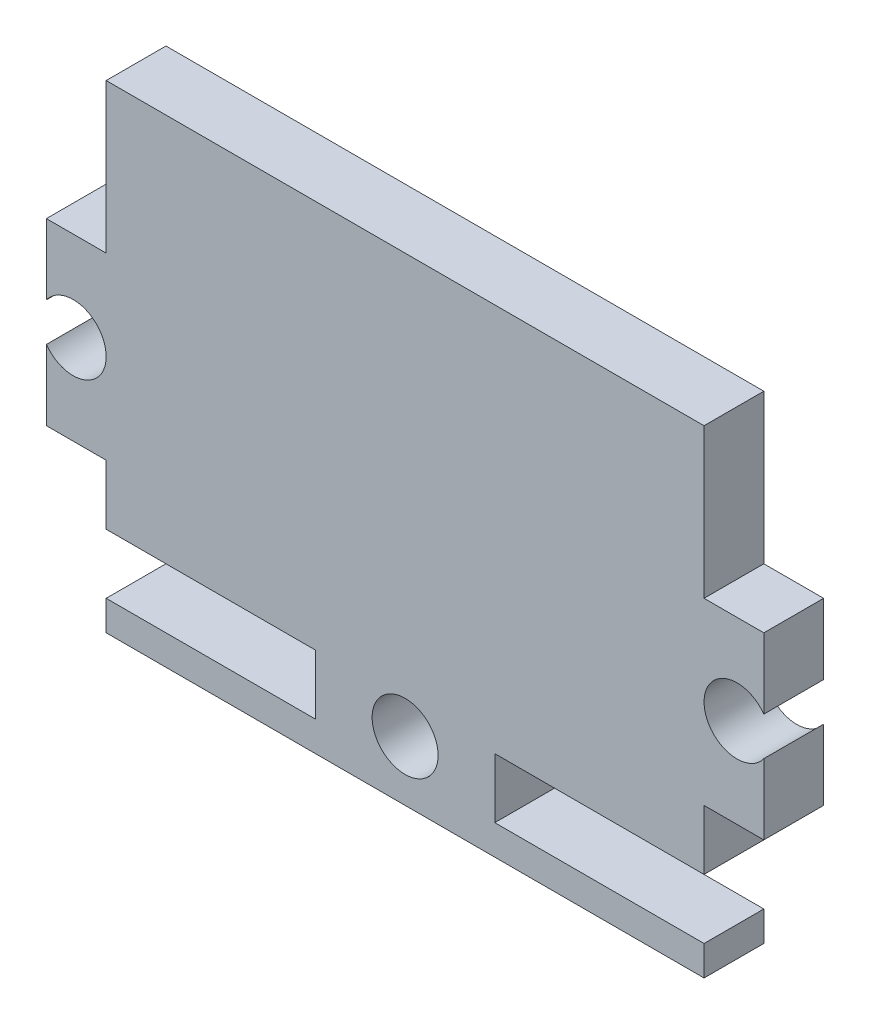
ISO-10303-21;
HEADER;
FILE_DESCRIPTION(('STEP AP214'),'2;1');
FILE_NAME('part.step','',(''),(''),'','','');
FILE_SCHEMA(('AUTOMOTIVE_DESIGN { 1 0 10303 214 1 1 1 1 }'));
ENDSEC;
DATA;
#1=APPLICATION_CONTEXT('core data for automotive mechanical design processes');
#2=APPLICATION_PROTOCOL_DEFINITION('international standard','automotive_design',2000,#1);
#3=PRODUCT_CONTEXT('',#1,'mechanical');
#4=PRODUCT('Part','Part','',(#3));
#5=PRODUCT_RELATED_PRODUCT_CATEGORY('part','',(#4));
#6=PRODUCT_DEFINITION_FORMATION('','',#4);
#7=PRODUCT_DEFINITION_CONTEXT('part definition',#1,'design');
#8=PRODUCT_DEFINITION('design','',#6,#7);
#9=PRODUCT_DEFINITION_SHAPE('','',#8);
#10=(LENGTH_UNIT() NAMED_UNIT(*) SI_UNIT(.MILLI.,.METRE.));
#11=(NAMED_UNIT(*) PLANE_ANGLE_UNIT() SI_UNIT($,.RADIAN.));
#12=(NAMED_UNIT(*) SI_UNIT($,.STERADIAN.) SOLID_ANGLE_UNIT());
#13=UNCERTAINTY_MEASURE_WITH_UNIT(LENGTH_MEASURE(1.E-05),#10,'distance_accuracy_value','');
#14=(GEOMETRIC_REPRESENTATION_CONTEXT(3) GLOBAL_UNCERTAINTY_ASSIGNED_CONTEXT((#13)) GLOBAL_UNIT_ASSIGNED_CONTEXT((#10,
#11,#12)) REPRESENTATION_CONTEXT('',''));
#15=CARTESIAN_POINT('',(0.,0.,0.));
#16=DIRECTION('',(0.,0.,1.));
#17=DIRECTION('',(1.,0.,0.));
#18=AXIS2_PLACEMENT_3D('',#15,#16,#17);
#19=CARTESIAN_POINT('',(38.1,0.,3.175));
#20=DIRECTION('',(-1.,0.,0.));
#21=DIRECTION('',(0.,0.,1.));
#22=AXIS2_PLACEMENT_3D('',#19,#20,#21);
#23=PLANE('',#22);
#24=DIRECTION('',(0.,1.,0.));
#25=VECTOR('',#24,1.);
#26=CARTESIAN_POINT('',(38.1,0.,0.));
#27=LINE('',#26,#25);
#28=CARTESIAN_POINT('',(38.1,7.93749999999999,0.));
#29=VERTEX_POINT('',#28);
#30=CARTESIAN_POINT('',(38.1,11.6760932659661,0.));
#31=VERTEX_POINT('',#30);
#32=EDGE_CURVE('E346',#29,#31,#27,.T.);
#33=ORIENTED_EDGE('',*,*,#32,.T.);
#34=DIRECTION('',(0.,0.,-1.));
#35=VECTOR('',#34,1.);
#36=CARTESIAN_POINT('',(38.1,11.6760932659661,3.175));
#37=LINE('',#36,#35);
#38=CARTESIAN_POINT('',(38.1,11.6760932659661,3.175));
#39=VERTEX_POINT('',#38);
#40=EDGE_CURVE('E11',#39,#31,#37,.T.);
#41=ORIENTED_EDGE('',*,*,#40,.F.);
#42=DIRECTION('',(0.,1.,0.));
#43=VECTOR('',#42,1.);
#44=CARTESIAN_POINT('',(38.1,0.,3.175));
#45=LINE('',#44,#43);
#46=CARTESIAN_POINT('',(38.1,7.93749999999999,3.175));
#47=VERTEX_POINT('',#46);
#48=EDGE_CURVE('E273',#47,#39,#45,.T.);
#49=ORIENTED_EDGE('',*,*,#48,.F.);
#50=DIRECTION('',(0.,0.,-1.));
#51=VECTOR('',#50,1.);
#52=CARTESIAN_POINT('',(38.1,7.93749999999999,3.175));
#53=LINE('',#52,#51);
#54=EDGE_CURVE('E52',#47,#29,#53,.T.);
#55=ORIENTED_EDGE('',*,*,#54,.T.);
#56=EDGE_LOOP('',(#33,#41,#49,#55));
#57=FACE_BOUND('',#56,.T.);
#58=ADVANCED_FACE('F35',(#57),#23,.F.);
#59=CARTESIAN_POINT('',(36.6776,12.7,3.175));
#60=DIRECTION('',(0.,0.,-1.));
#61=DIRECTION('',(-1.,0.,0.));
#62=AXIS2_PLACEMENT_3D('',#59,#60,#61);
#63=CYLINDRICAL_SURFACE('',#62,1.7526);
#64=CARTESIAN_POINT('',(36.6776,12.7,0.));
#65=DIRECTION('',(0.,0.,1.));
#66=DIRECTION('',(1.,0.,0.));
#67=AXIS2_PLACEMENT_3D('',#64,#65,#66);
#68=CIRCLE('',#67,1.7526);
#69=CARTESIAN_POINT('',(38.1,13.7239067340339,0.));
#70=VERTEX_POINT('',#69);
#71=EDGE_CURVE('E341',#31,#70,#68,.F.);
#72=ORIENTED_EDGE('',*,*,#71,.T.);
#73=DIRECTION('',(0.,0.,-1.));
#74=VECTOR('',#73,1.);
#75=CARTESIAN_POINT('',(38.1,13.7239067340339,3.175));
#76=LINE('',#75,#74);
#77=CARTESIAN_POINT('',(38.1,13.7239067340339,3.175));
#78=VERTEX_POINT('',#77);
#79=EDGE_CURVE('E44',#78,#70,#76,.T.);
#80=ORIENTED_EDGE('',*,*,#79,.F.);
#81=CARTESIAN_POINT('',(36.6776,12.7,3.175));
#82=DIRECTION('',(0.,0.,1.));
#83=DIRECTION('',(1.,0.,0.));
#84=AXIS2_PLACEMENT_3D('',#81,#82,#83);
#85=CIRCLE('',#84,1.7526);
#86=EDGE_CURVE('E138',#39,#78,#85,.F.);
#87=ORIENTED_EDGE('',*,*,#86,.F.);
#88=ORIENTED_EDGE('',*,*,#40,.T.);
#89=EDGE_LOOP('',(#72,#80,#87,#88));
#90=FACE_BOUND('',#89,.T.);
#91=ADVANCED_FACE('F411',(#90),#63,.F.);
#92=CARTESIAN_POINT('',(38.1,17.4625,0.));
#93=VERTEX_POINT('',#92);
#94=EDGE_CURVE('E338',#70,#93,#27,.T.);
#95=ORIENTED_EDGE('',*,*,#94,.T.);
#96=DIRECTION('',(0.,0.,-1.));
#97=VECTOR('',#96,1.);
#98=CARTESIAN_POINT('',(38.1,17.4625,3.175));
#99=LINE('',#98,#97);
#100=CARTESIAN_POINT('',(38.1,17.4625,3.175));
#101=VERTEX_POINT('',#100);
#102=EDGE_CURVE('E330',#101,#93,#99,.T.);
#103=ORIENTED_EDGE('',*,*,#102,.F.);
#104=EDGE_CURVE('E271',#78,#101,#45,.T.);
#105=ORIENTED_EDGE('',*,*,#104,.F.);
#106=ORIENTED_EDGE('',*,*,#79,.T.);
#107=EDGE_LOOP('',(#95,#103,#105,#106));
#108=FACE_BOUND('',#107,.T.);
#109=ADVANCED_FACE('F336',(#108),#23,.F.);
#110=CARTESIAN_POINT('',(0.,17.4625,3.175));
#111=DIRECTION('',(0.,-1.,0.));
#112=DIRECTION('',(1.,0.,0.));
#113=AXIS2_PLACEMENT_3D('',#110,#111,#112);
#114=PLANE('',#113);
#115=DIRECTION('',(-1.,0.,0.));
#116=VECTOR('',#115,1.);
#117=CARTESIAN_POINT('',(0.,17.4625,0.));
#118=LINE('',#117,#116);
#119=CARTESIAN_POINT('',(34.925,17.4625,0.));
#120=VERTEX_POINT('',#119);
#121=EDGE_CURVE('E344',#93,#120,#118,.T.);
#122=ORIENTED_EDGE('',*,*,#121,.T.);
#123=DIRECTION('',(0.,0.,-1.));
#124=VECTOR('',#123,1.);
#125=CARTESIAN_POINT('',(34.925,17.4625,3.175));
#126=LINE('',#125,#124);
#127=CARTESIAN_POINT('',(34.925,17.4625,3.175));
#128=VERTEX_POINT('',#127);
#129=EDGE_CURVE('E328',#128,#120,#126,.T.);
#130=ORIENTED_EDGE('',*,*,#129,.F.);
#131=DIRECTION('',(-1.,0.,0.));
#132=VECTOR('',#131,1.);
#133=CARTESIAN_POINT('',(0.,17.4625,3.175));
#134=LINE('',#133,#132);
#135=EDGE_CURVE('E269',#101,#128,#134,.T.);
#136=ORIENTED_EDGE('',*,*,#135,.F.);
#137=ORIENTED_EDGE('',*,*,#102,.T.);
#138=EDGE_LOOP('',(#122,#130,#136,#137));
#139=FACE_BOUND('',#138,.T.);
#140=ADVANCED_FACE('F409',(#139),#114,.F.);
#141=CARTESIAN_POINT('',(34.925,0.,3.175));
#142=DIRECTION('',(1.,0.,0.));
#143=DIRECTION('',(0.,1.,0.));
#144=AXIS2_PLACEMENT_3D('',#141,#142,#143);
#145=PLANE('',#144);
#146=DIRECTION('',(0.,-1.,0.));
#147=VECTOR('',#146,1.);
#148=CARTESIAN_POINT('',(34.925,0.,0.));
#149=LINE('',#148,#147);
#150=CARTESIAN_POINT('',(34.925,25.4,0.));
#151=VERTEX_POINT('',#150);
#152=EDGE_CURVE('E347',#151,#120,#149,.T.);
#153=ORIENTED_EDGE('',*,*,#152,.F.);
#154=DIRECTION('',(0.,0.,-1.));
#155=VECTOR('',#154,1.);
#156=CARTESIAN_POINT('',(34.925,25.4,3.175));
#157=LINE('',#156,#155);
#158=CARTESIAN_POINT('',(34.925,25.4,3.175));
#159=VERTEX_POINT('',#158);
#160=EDGE_CURVE('E326',#159,#151,#157,.T.);
#161=ORIENTED_EDGE('',*,*,#160,.F.);
#162=DIRECTION('',(0.,-1.,0.));
#163=VECTOR('',#162,1.);
#164=CARTESIAN_POINT('',(34.925,0.,3.175));
#165=LINE('',#164,#163);
#166=EDGE_CURVE('E266',#159,#128,#165,.T.);
#167=ORIENTED_EDGE('',*,*,#166,.T.);
#168=ORIENTED_EDGE('',*,*,#129,.T.);
#169=EDGE_LOOP('',(#153,#161,#167,#168));
#170=FACE_BOUND('',#169,.T.);
#171=ADVANCED_FACE('F404',(#170),#145,.T.);
#172=CARTESIAN_POINT('',(0.,25.4,3.175));
#173=DIRECTION('',(0.,1.,0.));
#174=DIRECTION('',(-1.,0.,0.));
#175=AXIS2_PLACEMENT_3D('',#172,#173,#174);
#176=PLANE('',#175);
#177=DIRECTION('',(1.,0.,0.));
#178=VECTOR('',#177,1.);
#179=CARTESIAN_POINT('',(0.,25.4,0.));
#180=LINE('',#179,#178);
#181=CARTESIAN_POINT('',(3.175,25.4,0.));
#182=VERTEX_POINT('',#181);
#183=EDGE_CURVE('E397',#182,#151,#180,.T.);
#184=ORIENTED_EDGE('',*,*,#183,.F.);
#185=DIRECTION('',(0.,0.,-1.));
#186=VECTOR('',#185,1.);
#187=CARTESIAN_POINT('',(3.175,25.4,3.175));
#188=LINE('',#187,#186);
#189=CARTESIAN_POINT('',(3.175,25.4,3.175));
#190=VERTEX_POINT('',#189);
#191=EDGE_CURVE('E324',#190,#182,#188,.T.);
#192=ORIENTED_EDGE('',*,*,#191,.F.);
#193=DIRECTION('',(1.,0.,0.));
#194=VECTOR('',#193,1.);
#195=CARTESIAN_POINT('',(0.,25.4,3.175));
#196=LINE('',#195,#194);
#197=EDGE_CURVE('E263',#190,#159,#196,.T.);
#198=ORIENTED_EDGE('',*,*,#197,.T.);
#199=ORIENTED_EDGE('',*,*,#160,.T.);
#200=EDGE_LOOP('',(#184,#192,#198,#199));
#201=FACE_BOUND('',#200,.T.);
#202=ADVANCED_FACE('F423',(#201),#176,.T.);
#203=CARTESIAN_POINT('',(3.175,0.,3.175));
#204=DIRECTION('',(1.,0.,0.));
#205=DIRECTION('',(0.,1.,0.));
#206=AXIS2_PLACEMENT_3D('',#203,#204,#205);
#207=PLANE('',#206);
#208=DIRECTION('',(0.,-1.,0.));
#209=VECTOR('',#208,1.);
#210=CARTESIAN_POINT('',(3.175,0.,0.));
#211=LINE('',#210,#209);
#212=CARTESIAN_POINT('',(3.175,17.4625,0.));
#213=VERTEX_POINT('',#212);
#214=EDGE_CURVE('E394',#182,#213,#211,.T.);
#215=ORIENTED_EDGE('',*,*,#214,.T.);
#216=DIRECTION('',(0.,0.,-1.));
#217=VECTOR('',#216,1.);
#218=CARTESIAN_POINT('',(3.175,17.4625,3.175));
#219=LINE('',#218,#217);
#220=CARTESIAN_POINT('',(3.175,17.4625,3.175));
#221=VERTEX_POINT('',#220);
#222=EDGE_CURVE('E322',#221,#213,#219,.T.);
#223=ORIENTED_EDGE('',*,*,#222,.F.);
#224=DIRECTION('',(0.,-1.,0.));
#225=VECTOR('',#224,1.);
#226=CARTESIAN_POINT('',(3.175,0.,3.175));
#227=LINE('',#226,#225);
#228=EDGE_CURVE('E261',#190,#221,#227,.T.);
#229=ORIENTED_EDGE('',*,*,#228,.F.);
#230=ORIENTED_EDGE('',*,*,#191,.T.);
#231=EDGE_LOOP('',(#215,#223,#229,#230));
#232=FACE_BOUND('',#231,.T.);
#233=ADVANCED_FACE('F426',(#232),#207,.F.);
#234=CARTESIAN_POINT('',(0.,17.4625,3.175));
#235=DIRECTION('',(0.,1.,0.));
#236=DIRECTION('',(-1.,0.,0.));
#237=AXIS2_PLACEMENT_3D('',#234,#235,#236);
#238=PLANE('',#237);
#239=DIRECTION('',(1.,0.,0.));
#240=VECTOR('',#239,1.);
#241=CARTESIAN_POINT('',(0.,17.4625,0.));
#242=LINE('',#241,#240);
#243=CARTESIAN_POINT('',(0.,17.4625,0.));
#244=VERTEX_POINT('',#243);
#245=EDGE_CURVE('E391',#244,#213,#242,.T.);
#246=ORIENTED_EDGE('',*,*,#245,.F.);
#247=DIRECTION('',(0.,0.,-1.));
#248=VECTOR('',#247,1.);
#249=CARTESIAN_POINT('',(0.,17.4625,3.175));
#250=LINE('',#249,#248);
#251=CARTESIAN_POINT('',(0.,17.4625,3.175));
#252=VERTEX_POINT('',#251);
#253=EDGE_CURVE('E320',#252,#244,#250,.T.);
#254=ORIENTED_EDGE('',*,*,#253,.F.);
#255=DIRECTION('',(1.,0.,0.));
#256=VECTOR('',#255,1.);
#257=CARTESIAN_POINT('',(0.,17.4625,3.175));
#258=LINE('',#257,#256);
#259=EDGE_CURVE('E258',#252,#221,#258,.T.);
#260=ORIENTED_EDGE('',*,*,#259,.T.);
#261=ORIENTED_EDGE('',*,*,#222,.T.);
#262=EDGE_LOOP('',(#246,#254,#260,#261));
#263=FACE_BOUND('',#262,.T.);
#264=ADVANCED_FACE('F430',(#263),#238,.T.);
#265=CARTESIAN_POINT('',(0.,0.,3.175));
#266=DIRECTION('',(-1.,0.,0.));
#267=DIRECTION('',(0.,-1.,0.));
#268=AXIS2_PLACEMENT_3D('',#265,#266,#267);
#269=PLANE('',#268);
#270=DIRECTION('',(0.,1.,0.));
#271=VECTOR('',#270,1.);
#272=CARTESIAN_POINT('',(0.,0.,0.));
#273=LINE('',#272,#271);
#274=CARTESIAN_POINT('',(0.,13.7239067340339,0.));
#275=VERTEX_POINT('',#274);
#276=EDGE_CURVE('E388',#275,#244,#273,.T.);
#277=ORIENTED_EDGE('',*,*,#276,.F.);
#278=DIRECTION('',(0.,0.,-1.));
#279=VECTOR('',#278,1.);
#280=CARTESIAN_POINT('',(0.,13.7239067340339,3.175));
#281=LINE('',#280,#279);
#282=CARTESIAN_POINT('',(0.,13.7239067340339,3.175));
#283=VERTEX_POINT('',#282);
#284=EDGE_CURVE('E318',#283,#275,#281,.T.);
#285=ORIENTED_EDGE('',*,*,#284,.F.);
#286=DIRECTION('',(0.,1.,0.));
#287=VECTOR('',#286,1.);
#288=CARTESIAN_POINT('',(0.,0.,3.175));
#289=LINE('',#288,#287);
#290=EDGE_CURVE('E255',#283,#252,#289,.T.);
#291=ORIENTED_EDGE('',*,*,#290,.T.);
#292=ORIENTED_EDGE('',*,*,#253,.T.);
#293=EDGE_LOOP('',(#277,#285,#291,#292));
#294=FACE_BOUND('',#293,.T.);
#295=ADVANCED_FACE('F434',(#294),#269,.T.);
#296=CARTESIAN_POINT('',(1.4224,12.7,3.175));
#297=DIRECTION('',(0.,0.,-1.));
#298=DIRECTION('',(-1.,0.,0.));
#299=AXIS2_PLACEMENT_3D('',#296,#297,#298);
#300=CYLINDRICAL_SURFACE('',#299,1.7526);
#301=CARTESIAN_POINT('',(1.4224,12.7,0.));
#302=DIRECTION('',(0.,0.,1.));
#303=DIRECTION('',(1.,0.,0.));
#304=AXIS2_PLACEMENT_3D('',#301,#302,#303);
#305=CIRCLE('',#304,1.7526);
#306=CARTESIAN_POINT('',(0.,11.6760932659661,0.));
#307=VERTEX_POINT('',#306);
#308=EDGE_CURVE('E385',#307,#275,#305,.T.);
#309=ORIENTED_EDGE('',*,*,#308,.F.);
#310=DIRECTION('',(0.,0.,-1.));
#311=VECTOR('',#310,1.);
#312=CARTESIAN_POINT('',(0.,11.6760932659661,3.175));
#313=LINE('',#312,#311);
#314=CARTESIAN_POINT('',(0.,11.6760932659661,3.175));
#315=VERTEX_POINT('',#314);
#316=EDGE_CURVE('E316',#315,#307,#313,.T.);
#317=ORIENTED_EDGE('',*,*,#316,.F.);
#318=CARTESIAN_POINT('',(1.4224,12.7,3.175));
#319=DIRECTION('',(0.,0.,1.));
#320=DIRECTION('',(1.,0.,0.));
#321=AXIS2_PLACEMENT_3D('',#318,#319,#320);
#322=CIRCLE('',#321,1.7526);
#323=EDGE_CURVE('E252',#315,#283,#322,.T.);
#324=ORIENTED_EDGE('',*,*,#323,.T.);
#325=ORIENTED_EDGE('',*,*,#284,.T.);
#326=EDGE_LOOP('',(#309,#317,#324,#325));
#327=FACE_BOUND('',#326,.T.);
#328=ADVANCED_FACE('F436',(#327),#300,.F.);
#329=CARTESIAN_POINT('',(0.,7.93749999999999,0.));
#330=VERTEX_POINT('',#329);
#331=EDGE_CURVE('E384',#330,#307,#273,.T.);
#332=ORIENTED_EDGE('',*,*,#331,.F.);
#333=DIRECTION('',(0.,0.,-1.));
#334=VECTOR('',#333,1.);
#335=CARTESIAN_POINT('',(0.,7.93749999999999,3.175));
#336=LINE('',#335,#334);
#337=CARTESIAN_POINT('',(0.,7.93749999999999,3.175));
#338=VERTEX_POINT('',#337);
#339=EDGE_CURVE('E314',#338,#330,#336,.T.);
#340=ORIENTED_EDGE('',*,*,#339,.F.);
#341=EDGE_CURVE('E251',#338,#315,#289,.T.);
#342=ORIENTED_EDGE('',*,*,#341,.T.);
#343=ORIENTED_EDGE('',*,*,#316,.T.);
#344=EDGE_LOOP('',(#332,#340,#342,#343));
#345=FACE_BOUND('',#344,.T.);
#346=ADVANCED_FACE('F439',(#345),#269,.T.);
#347=CARTESIAN_POINT('',(0.,7.93749999999999,3.175));
#348=DIRECTION('',(0.,1.,0.));
#349=DIRECTION('',(-1.,0.,0.));
#350=AXIS2_PLACEMENT_3D('',#347,#348,#349);
#351=PLANE('',#350);
#352=DIRECTION('',(1.,0.,0.));
#353=VECTOR('',#352,1.);
#354=CARTESIAN_POINT('',(0.,7.93749999999999,0.));
#355=LINE('',#354,#353);
#356=CARTESIAN_POINT('',(3.175,7.93749999999999,0.));
#357=VERTEX_POINT('',#356);
#358=EDGE_CURVE('E382',#330,#357,#355,.T.);
#359=ORIENTED_EDGE('',*,*,#358,.T.);
#360=DIRECTION('',(0.,0.,-1.));
#361=VECTOR('',#360,1.);
#362=CARTESIAN_POINT('',(3.175,7.93749999999999,3.175));
#363=LINE('',#362,#361);
#364=CARTESIAN_POINT('',(3.175,7.93749999999999,3.175));
#365=VERTEX_POINT('',#364);
#366=EDGE_CURVE('E311',#365,#357,#363,.T.);
#367=ORIENTED_EDGE('',*,*,#366,.F.);
#368=DIRECTION('',(1.,0.,0.));
#369=VECTOR('',#368,1.);
#370=CARTESIAN_POINT('',(0.,7.93749999999999,3.175));
#371=LINE('',#370,#369);
#372=EDGE_CURVE('E249',#338,#365,#371,.T.);
#373=ORIENTED_EDGE('',*,*,#372,.F.);
#374=ORIENTED_EDGE('',*,*,#339,.T.);
#375=EDGE_LOOP('',(#359,#367,#373,#374));
#376=FACE_BOUND('',#375,.T.);
#377=ADVANCED_FACE('F443',(#376),#351,.F.);
#378=CARTESIAN_POINT('',(3.175,0.,3.175));
#379=DIRECTION('',(1.,0.,0.));
#380=DIRECTION('',(0.,1.,0.));
#381=AXIS2_PLACEMENT_3D('',#378,#379,#380);
#382=PLANE('',#381);
#383=DIRECTION('',(0.,-1.,0.));
#384=VECTOR('',#383,1.);
#385=CARTESIAN_POINT('',(3.175,0.,0.));
#386=LINE('',#385,#384);
#387=CARTESIAN_POINT('',(3.175,4.7625,0.));
#388=VERTEX_POINT('',#387);
#389=EDGE_CURVE('E379',#357,#388,#386,.T.);
#390=ORIENTED_EDGE('',*,*,#389,.T.);
#391=DIRECTION('',(0.,0.,-1.));
#392=VECTOR('',#391,1.);
#393=CARTESIAN_POINT('',(3.175,4.7625,3.175));
#394=LINE('',#393,#392);
#395=CARTESIAN_POINT('',(3.175,4.7625,3.175));
#396=VERTEX_POINT('',#395);
#397=EDGE_CURVE('E309',#396,#388,#394,.T.);
#398=ORIENTED_EDGE('',*,*,#397,.F.);
#399=DIRECTION('',(0.,-1.,0.));
#400=VECTOR('',#399,1.);
#401=CARTESIAN_POINT('',(3.175,0.,3.175));
#402=LINE('',#401,#400);
#403=EDGE_CURVE('E241',#365,#396,#402,.T.);
#404=ORIENTED_EDGE('',*,*,#403,.F.);
#405=ORIENTED_EDGE('',*,*,#366,.T.);
#406=EDGE_LOOP('',(#390,#398,#404,#405));
#407=FACE_BOUND('',#406,.T.);
#408=ADVANCED_FACE('F447',(#407),#382,.F.);
#409=CARTESIAN_POINT('',(0.,4.7625,3.175));
#410=DIRECTION('',(0.,-1.,0.));
#411=DIRECTION('',(1.,0.,0.));
#412=AXIS2_PLACEMENT_3D('',#409,#410,#411);
#413=PLANE('',#412);
#414=DIRECTION('',(-1.,0.,0.));
#415=VECTOR('',#414,1.);
#416=CARTESIAN_POINT('',(0.,4.7625,0.));
#417=LINE('',#416,#415);
#418=CARTESIAN_POINT('',(14.2875,4.7625,0.));
#419=VERTEX_POINT('',#418);
#420=EDGE_CURVE('E376',#419,#388,#417,.T.);
#421=ORIENTED_EDGE('',*,*,#420,.F.);
#422=DIRECTION('',(0.,0.,-1.));
#423=VECTOR('',#422,1.);
#424=CARTESIAN_POINT('',(14.2875,4.7625,3.175));
#425=LINE('',#424,#423);
#426=CARTESIAN_POINT('',(14.2875,4.7625,3.175));
#427=VERTEX_POINT('',#426);
#428=EDGE_CURVE('E307',#427,#419,#425,.T.);
#429=ORIENTED_EDGE('',*,*,#428,.F.);
#430=DIRECTION('',(-1.,0.,0.));
#431=VECTOR('',#430,1.);
#432=CARTESIAN_POINT('',(0.,4.7625,3.175));
#433=LINE('',#432,#431);
#434=EDGE_CURVE('E246',#427,#396,#433,.T.);
#435=ORIENTED_EDGE('',*,*,#434,.T.);
#436=ORIENTED_EDGE('',*,*,#397,.T.);
#437=EDGE_LOOP('',(#421,#429,#435,#436));
#438=FACE_BOUND('',#437,.T.);
#439=ADVANCED_FACE('F449',(#438),#413,.T.);
#440=CARTESIAN_POINT('',(14.2875,0.,3.175));
#441=DIRECTION('',(1.,0.,0.));
#442=DIRECTION('',(0.,1.,0.));
#443=AXIS2_PLACEMENT_3D('',#440,#441,#442);
#444=PLANE('',#443);
#445=DIRECTION('',(0.,-1.,0.));
#446=VECTOR('',#445,1.);
#447=CARTESIAN_POINT('',(14.2875,0.,0.));
#448=LINE('',#447,#446);
#449=CARTESIAN_POINT('',(14.2875,1.5875,0.));
#450=VERTEX_POINT('',#449);
#451=EDGE_CURVE('E374',#419,#450,#448,.T.);
#452=ORIENTED_EDGE('',*,*,#451,.T.);
#453=DIRECTION('',(0.,0.,-1.));
#454=VECTOR('',#453,1.);
#455=CARTESIAN_POINT('',(14.2875,1.5875,3.175));
#456=LINE('',#455,#454);
#457=CARTESIAN_POINT('',(14.2875,1.5875,3.175));
#458=VERTEX_POINT('',#457);
#459=EDGE_CURVE('E304',#458,#450,#456,.T.);
#460=ORIENTED_EDGE('',*,*,#459,.F.);
#461=DIRECTION('',(0.,-1.,0.));
#462=VECTOR('',#461,1.);
#463=CARTESIAN_POINT('',(14.2875,0.,3.175));
#464=LINE('',#463,#462);
#465=EDGE_CURVE('E244',#427,#458,#464,.T.);
#466=ORIENTED_EDGE('',*,*,#465,.F.);
#467=ORIENTED_EDGE('',*,*,#428,.T.);
#468=EDGE_LOOP('',(#452,#460,#466,#467));
#469=FACE_BOUND('',#468,.T.);
#470=ADVANCED_FACE('F452',(#469),#444,.F.);
#471=CARTESIAN_POINT('',(0.,1.5875,3.175));
#472=DIRECTION('',(0.,-1.,0.));
#473=DIRECTION('',(1.,0.,0.));
#474=AXIS2_PLACEMENT_3D('',#471,#472,#473);
#475=PLANE('',#474);
#476=DIRECTION('',(-1.,0.,0.));
#477=VECTOR('',#476,1.);
#478=CARTESIAN_POINT('',(0.,1.5875,0.));
#479=LINE('',#478,#477);
#480=CARTESIAN_POINT('',(3.175,1.5875,0.));
#481=VERTEX_POINT('',#480);
#482=EDGE_CURVE('E372',#450,#481,#479,.T.);
#483=ORIENTED_EDGE('',*,*,#482,.T.);
#484=DIRECTION('',(0.,0.,-1.));
#485=VECTOR('',#484,1.);
#486=CARTESIAN_POINT('',(3.175,1.5875,3.175));
#487=LINE('',#486,#485);
#488=CARTESIAN_POINT('',(3.175,1.5875,3.175));
#489=VERTEX_POINT('',#488);
#490=EDGE_CURVE('E301',#489,#481,#487,.T.);
#491=ORIENTED_EDGE('',*,*,#490,.F.);
#492=DIRECTION('',(-1.,0.,0.));
#493=VECTOR('',#492,1.);
#494=CARTESIAN_POINT('',(0.,1.5875,3.175));
#495=LINE('',#494,#493);
#496=EDGE_CURVE('E239',#458,#489,#495,.T.);
#497=ORIENTED_EDGE('',*,*,#496,.F.);
#498=ORIENTED_EDGE('',*,*,#459,.T.);
#499=EDGE_LOOP('',(#483,#491,#497,#498));
#500=FACE_BOUND('',#499,.T.);
#501=ADVANCED_FACE('F456',(#500),#475,.F.);
#502=CARTESIAN_POINT('',(3.175,0.,0.));
#503=VERTEX_POINT('',#502);
#504=EDGE_CURVE('E371',#481,#503,#386,.T.);
#505=ORIENTED_EDGE('',*,*,#504,.T.);
#506=DIRECTION('',(0.,0.,-1.));
#507=VECTOR('',#506,1.);
#508=CARTESIAN_POINT('',(3.175,0.,3.175));
#509=LINE('',#508,#507);
#510=CARTESIAN_POINT('',(3.175,0.,3.175));
#511=VERTEX_POINT('',#510);
#512=EDGE_CURVE('E298',#511,#503,#509,.T.);
#513=ORIENTED_EDGE('',*,*,#512,.F.);
#514=EDGE_CURVE('E236',#489,#511,#402,.T.);
#515=ORIENTED_EDGE('',*,*,#514,.F.);
#516=ORIENTED_EDGE('',*,*,#490,.T.);
#517=EDGE_LOOP('',(#505,#513,#515,#516));
#518=FACE_BOUND('',#517,.T.);
#519=ADVANCED_FACE('F460',(#518),#382,.F.);
#520=CARTESIAN_POINT('',(0.,0.,3.175));
#521=DIRECTION('',(0.,1.,0.));
#522=DIRECTION('',(0.,0.,1.));
#523=AXIS2_PLACEMENT_3D('',#520,#521,#522);
#524=PLANE('',#523);
#525=DIRECTION('',(1.,0.,0.));
#526=VECTOR('',#525,1.);
#527=CARTESIAN_POINT('',(0.,0.,0.));
#528=LINE('',#527,#526);
#529=CARTESIAN_POINT('',(34.925,0.,0.));
#530=VERTEX_POINT('',#529);
#531=EDGE_CURVE('E368',#503,#530,#528,.T.);
#532=ORIENTED_EDGE('',*,*,#531,.T.);
#533=DIRECTION('',(0.,0.,-1.));
#534=VECTOR('',#533,1.);
#535=CARTESIAN_POINT('',(34.925,0.,3.175));
#536=LINE('',#535,#534);
#537=CARTESIAN_POINT('',(34.925,0.,3.175));
#538=VERTEX_POINT('',#537);
#539=EDGE_CURVE('E296',#538,#530,#536,.T.);
#540=ORIENTED_EDGE('',*,*,#539,.F.);
#541=DIRECTION('',(1.,0.,0.));
#542=VECTOR('',#541,1.);
#543=CARTESIAN_POINT('',(0.,0.,3.175));
#544=LINE('',#543,#542);
#545=EDGE_CURVE('E232',#511,#538,#544,.T.);
#546=ORIENTED_EDGE('',*,*,#545,.F.);
#547=ORIENTED_EDGE('',*,*,#512,.T.);
#548=EDGE_LOOP('',(#532,#540,#546,#547));
#549=FACE_BOUND('',#548,.T.);
#550=ADVANCED_FACE('F464',(#549),#524,.F.);
#551=CARTESIAN_POINT('',(34.925,0.,3.175));
#552=DIRECTION('',(1.,0.,0.));
#553=DIRECTION('',(0.,1.,0.));
#554=AXIS2_PLACEMENT_3D('',#551,#552,#553);
#555=PLANE('',#554);
#556=DIRECTION('',(0.,-1.,0.));
#557=VECTOR('',#556,1.);
#558=CARTESIAN_POINT('',(34.925,0.,0.));
#559=LINE('',#558,#557);
#560=CARTESIAN_POINT('',(34.925,1.5875,0.));
#561=VERTEX_POINT('',#560);
#562=EDGE_CURVE('E285',#561,#530,#559,.T.);
#563=ORIENTED_EDGE('',*,*,#562,.F.);
#564=DIRECTION('',(0.,0.,-1.));
#565=VECTOR('',#564,1.);
#566=CARTESIAN_POINT('',(34.925,1.5875,3.175));
#567=LINE('',#566,#565);
#568=CARTESIAN_POINT('',(34.925,1.5875,3.175));
#569=VERTEX_POINT('',#568);
#570=EDGE_CURVE('E294',#569,#561,#567,.T.);
#571=ORIENTED_EDGE('',*,*,#570,.F.);
#572=DIRECTION('',(0.,-1.,0.));
#573=VECTOR('',#572,1.);
#574=CARTESIAN_POINT('',(34.925,0.,3.175));
#575=LINE('',#574,#573);
#576=EDGE_CURVE('E226',#569,#538,#575,.T.);
#577=ORIENTED_EDGE('',*,*,#576,.T.);
#578=ORIENTED_EDGE('',*,*,#539,.T.);
#579=EDGE_LOOP('',(#563,#571,#577,#578));
#580=FACE_BOUND('',#579,.T.);
#581=ADVANCED_FACE('F468',(#580),#555,.T.);
#582=CARTESIAN_POINT('',(0.,1.58750000000006,3.175));
#583=DIRECTION('',(0.,1.,0.));
#584=DIRECTION('',(-1.,0.,0.));
#585=AXIS2_PLACEMENT_3D('',#582,#583,#584);
#586=PLANE('',#585);
#587=DIRECTION('',(1.,0.,0.));
#588=VECTOR('',#587,1.);
#589=CARTESIAN_POINT('',(0.,1.58750000000006,0.));
#590=LINE('',#589,#588);
#591=CARTESIAN_POINT('',(23.8125,1.58750000000002,0.));
#592=VERTEX_POINT('',#591);
#593=EDGE_CURVE('E364',#592,#561,#590,.T.);
#594=ORIENTED_EDGE('',*,*,#593,.F.);
#595=DIRECTION('',(0.,0.,-1.));
#596=VECTOR('',#595,1.);
#597=CARTESIAN_POINT('',(23.8125,1.58750000000002,3.175));
#598=LINE('',#597,#596);
#599=CARTESIAN_POINT('',(23.8125,1.58750000000002,3.175));
#600=VERTEX_POINT('',#599);
#601=EDGE_CURVE('E292',#600,#592,#598,.T.);
#602=ORIENTED_EDGE('',*,*,#601,.F.);
#603=DIRECTION('',(1.,0.,0.));
#604=VECTOR('',#603,1.);
#605=CARTESIAN_POINT('',(0.,1.58750000000006,3.175));
#606=LINE('',#605,#604);
#607=EDGE_CURVE('E231',#600,#569,#606,.T.);
#608=ORIENTED_EDGE('',*,*,#607,.T.);
#609=ORIENTED_EDGE('',*,*,#570,.T.);
#610=EDGE_LOOP('',(#594,#602,#608,#609));
#611=FACE_BOUND('',#610,.T.);
#612=ADVANCED_FACE('F470',(#611),#586,.T.);
#613=CARTESIAN_POINT('',(23.8125,0.,3.175));
#614=DIRECTION('',(1.,0.,0.));
#615=DIRECTION('',(0.,1.,0.));
#616=AXIS2_PLACEMENT_3D('',#613,#614,#615);
#617=PLANE('',#616);
#618=DIRECTION('',(0.,-1.,0.));
#619=VECTOR('',#618,1.);
#620=CARTESIAN_POINT('',(23.8125,0.,0.));
#621=LINE('',#620,#619);
#622=CARTESIAN_POINT('',(23.8125,4.7625,0.));
#623=VERTEX_POINT('',#622);
#624=EDGE_CURVE('E362',#623,#592,#621,.T.);
#625=ORIENTED_EDGE('',*,*,#624,.F.);
#626=DIRECTION('',(0.,0.,-1.));
#627=VECTOR('',#626,1.);
#628=CARTESIAN_POINT('',(23.8125,4.7625,3.175));
#629=LINE('',#628,#627);
#630=CARTESIAN_POINT('',(23.8125,4.7625,3.175));
#631=VERTEX_POINT('',#630);
#632=EDGE_CURVE('E221',#631,#623,#629,.T.);
#633=ORIENTED_EDGE('',*,*,#632,.F.);
#634=DIRECTION('',(0.,-1.,0.));
#635=VECTOR('',#634,1.);
#636=CARTESIAN_POINT('',(23.8125,0.,3.175));
#637=LINE('',#636,#635);
#638=EDGE_CURVE('E211',#631,#600,#637,.T.);
#639=ORIENTED_EDGE('',*,*,#638,.T.);
#640=ORIENTED_EDGE('',*,*,#601,.T.);
#641=EDGE_LOOP('',(#625,#633,#639,#640));
#642=FACE_BOUND('',#641,.T.);
#643=ADVANCED_FACE('F359',(#642),#617,.T.);
#644=CARTESIAN_POINT('',(0.,4.7625,3.175));
#645=DIRECTION('',(0.,1.,0.));
#646=DIRECTION('',(-1.,0.,0.));
#647=AXIS2_PLACEMENT_3D('',#644,#645,#646);
#648=PLANE('',#647);
#649=DIRECTION('',(1.,0.,0.));
#650=VECTOR('',#649,1.);
#651=CARTESIAN_POINT('',(0.,4.7625,0.));
#652=LINE('',#651,#650);
#653=CARTESIAN_POINT('',(34.925,4.7625,0.));
#654=VERTEX_POINT('',#653);
#655=EDGE_CURVE('E218',#623,#654,#652,.T.);
#656=ORIENTED_EDGE('',*,*,#655,.T.);
#657=DIRECTION('',(0.,0.,-1.));
#658=VECTOR('',#657,1.);
#659=CARTESIAN_POINT('',(34.925,4.7625,3.175));
#660=LINE('',#659,#658);
#661=CARTESIAN_POINT('',(34.925,4.7625,3.175));
#662=VERTEX_POINT('',#661);
#663=EDGE_CURVE('E215',#662,#654,#660,.T.);
#664=ORIENTED_EDGE('',*,*,#663,.F.);
#665=DIRECTION('',(1.,0.,0.));
#666=VECTOR('',#665,1.);
#667=CARTESIAN_POINT('',(0.,4.7625,3.175));
#668=LINE('',#667,#666);
#669=EDGE_CURVE('E203',#631,#662,#668,.T.);
#670=ORIENTED_EDGE('',*,*,#669,.F.);
#671=ORIENTED_EDGE('',*,*,#632,.T.);
#672=EDGE_LOOP('',(#656,#664,#670,#671));
#673=FACE_BOUND('',#672,.T.);
#674=ADVANCED_FACE('F216',(#673),#648,.F.);
#675=CARTESIAN_POINT('',(34.925,7.93749999999999,0.));
#676=VERTEX_POINT('',#675);
#677=EDGE_CURVE('E281',#676,#654,#559,.T.);
#678=ORIENTED_EDGE('',*,*,#677,.F.);
#679=DIRECTION('',(0.,0.,-1.));
#680=VECTOR('',#679,1.);
#681=CARTESIAN_POINT('',(34.925,7.93749999999999,3.175));
#682=LINE('',#681,#680);
#683=CARTESIAN_POINT('',(34.925,7.93749999999999,3.175));
#684=VERTEX_POINT('',#683);
#685=EDGE_CURVE('E126',#684,#676,#682,.T.);
#686=ORIENTED_EDGE('',*,*,#685,.F.);
#687=EDGE_CURVE('E208',#684,#662,#575,.T.);
#688=ORIENTED_EDGE('',*,*,#687,.T.);
#689=ORIENTED_EDGE('',*,*,#663,.T.);
#690=EDGE_LOOP('',(#678,#686,#688,#689));
#691=FACE_BOUND('',#690,.T.);
#692=ADVANCED_FACE('F223',(#691),#555,.T.);
#693=CARTESIAN_POINT('',(19.05,3.175,3.175));
#694=DIRECTION('',(0.,0.,-1.));
#695=DIRECTION('',(-1.,0.,0.));
#696=AXIS2_PLACEMENT_3D('',#693,#694,#695);
#697=CYLINDRICAL_SURFACE('',#696,1.7526);
#698=CARTESIAN_POINT('',(19.05,3.175,3.175));
#699=DIRECTION('',(0.,0.,1.));
#700=DIRECTION('',(1.,0.,0.));
#701=AXIS2_PLACEMENT_3D('',#698,#699,#700);
#702=CIRCLE('',#701,1.7526);
#703=CARTESIAN_POINT('',(20.8026,3.175,3.175));
#704=VERTEX_POINT('',#703);
#705=EDGE_CURVE('E275',#704,#704,#702,.T.);
#706=ORIENTED_EDGE('',*,*,#705,.T.);
#707=EDGE_LOOP('',(#706));
#708=FACE_BOUND('',#707,.T.);
#709=CARTESIAN_POINT('',(19.05,3.175,0.));
#710=DIRECTION('',(0.,0.,1.));
#711=DIRECTION('',(1.,0.,0.));
#712=AXIS2_PLACEMENT_3D('',#709,#710,#711);
#713=CIRCLE('',#712,1.7526);
#714=CARTESIAN_POINT('',(20.8026,3.175,0.));
#715=VERTEX_POINT('',#714);
#716=EDGE_CURVE('E351',#715,#715,#713,.T.);
#717=ORIENTED_EDGE('',*,*,#716,.F.);
#718=EDGE_LOOP('',(#717));
#719=FACE_BOUND('',#718,.T.);
#720=ADVANCED_FACE('F37',(#708,#719),#697,.F.);
#721=CARTESIAN_POINT('',(0.,7.93749999999995,3.175));
#722=DIRECTION('',(0.,-1.,0.));
#723=DIRECTION('',(1.,0.,0.));
#724=AXIS2_PLACEMENT_3D('',#721,#722,#723);
#725=PLANE('',#724);
#726=DIRECTION('',(-1.,0.,0.));
#727=VECTOR('',#726,1.);
#728=CARTESIAN_POINT('',(0.,7.93749999999995,0.));
#729=LINE('',#728,#727);
#730=EDGE_CURVE('E277',#29,#676,#729,.T.);
#731=ORIENTED_EDGE('',*,*,#730,.F.);
#732=ORIENTED_EDGE('',*,*,#54,.F.);
#733=DIRECTION('',(-1.,0.,0.));
#734=VECTOR('',#733,1.);
#735=CARTESIAN_POINT('',(0.,7.93749999999995,3.175));
#736=LINE('',#735,#734);
#737=EDGE_CURVE('E224',#47,#684,#736,.T.);
#738=ORIENTED_EDGE('',*,*,#737,.T.);
#739=ORIENTED_EDGE('',*,*,#685,.T.);
#740=EDGE_LOOP('',(#731,#732,#738,#739));
#741=FACE_BOUND('',#740,.T.);
#742=ADVANCED_FACE('F480',(#741),#725,.T.);
#743=CARTESIAN_POINT('',(0.,0.,3.175));
#744=DIRECTION('',(0.,0.,1.));
#745=DIRECTION('',(1.,0.,0.));
#746=AXIS2_PLACEMENT_3D('',#743,#744,#745);
#747=PLANE('',#746);
#748=ORIENTED_EDGE('',*,*,#705,.F.);
#749=EDGE_LOOP('',(#748));
#750=FACE_BOUND('',#749,.T.);
#751=ORIENTED_EDGE('',*,*,#48,.T.);
#752=ORIENTED_EDGE('',*,*,#86,.T.);
#753=ORIENTED_EDGE('',*,*,#104,.T.);
#754=ORIENTED_EDGE('',*,*,#135,.T.);
#755=ORIENTED_EDGE('',*,*,#166,.F.);
#756=ORIENTED_EDGE('',*,*,#197,.F.);
#757=ORIENTED_EDGE('',*,*,#228,.T.);
#758=ORIENTED_EDGE('',*,*,#259,.F.);
#759=ORIENTED_EDGE('',*,*,#290,.F.);
#760=ORIENTED_EDGE('',*,*,#323,.F.);
#761=ORIENTED_EDGE('',*,*,#341,.F.);
#762=ORIENTED_EDGE('',*,*,#372,.T.);
#763=ORIENTED_EDGE('',*,*,#403,.T.);
#764=ORIENTED_EDGE('',*,*,#434,.F.);
#765=ORIENTED_EDGE('',*,*,#465,.T.);
#766=ORIENTED_EDGE('',*,*,#496,.T.);
#767=ORIENTED_EDGE('',*,*,#514,.T.);
#768=ORIENTED_EDGE('',*,*,#545,.T.);
#769=ORIENTED_EDGE('',*,*,#576,.F.);
#770=ORIENTED_EDGE('',*,*,#607,.F.);
#771=ORIENTED_EDGE('',*,*,#638,.F.);
#772=ORIENTED_EDGE('',*,*,#669,.T.);
#773=ORIENTED_EDGE('',*,*,#687,.F.);
#774=ORIENTED_EDGE('',*,*,#737,.F.);
#775=EDGE_LOOP('',(#751,#752,#753,#754,#755,#756,#757,#758,#759,#760,#761,#762,#763,#764,#765,
#766,#767,#768,#769,#770,#771,#772,#773,#774));
#776=FACE_BOUND('',#775,.T.);
#777=ADVANCED_FACE('F205',(#750,#776),#747,.T.);
#778=CARTESIAN_POINT('',(0.,0.,0.));
#779=DIRECTION('',(0.,0.,1.));
#780=DIRECTION('',(1.,0.,0.));
#781=AXIS2_PLACEMENT_3D('',#778,#779,#780);
#782=PLANE('',#781);
#783=ORIENTED_EDGE('',*,*,#716,.T.);
#784=EDGE_LOOP('',(#783));
#785=FACE_BOUND('',#784,.T.);
#786=ORIENTED_EDGE('',*,*,#32,.F.);
#787=ORIENTED_EDGE('',*,*,#730,.T.);
#788=ORIENTED_EDGE('',*,*,#677,.T.);
#789=ORIENTED_EDGE('',*,*,#655,.F.);
#790=ORIENTED_EDGE('',*,*,#624,.T.);
#791=ORIENTED_EDGE('',*,*,#593,.T.);
#792=ORIENTED_EDGE('',*,*,#562,.T.);
#793=ORIENTED_EDGE('',*,*,#531,.F.);
#794=ORIENTED_EDGE('',*,*,#504,.F.);
#795=ORIENTED_EDGE('',*,*,#482,.F.);
#796=ORIENTED_EDGE('',*,*,#451,.F.);
#797=ORIENTED_EDGE('',*,*,#420,.T.);
#798=ORIENTED_EDGE('',*,*,#389,.F.);
#799=ORIENTED_EDGE('',*,*,#358,.F.);
#800=ORIENTED_EDGE('',*,*,#331,.T.);
#801=ORIENTED_EDGE('',*,*,#308,.T.);
#802=ORIENTED_EDGE('',*,*,#276,.T.);
#803=ORIENTED_EDGE('',*,*,#245,.T.);
#804=ORIENTED_EDGE('',*,*,#214,.F.);
#805=ORIENTED_EDGE('',*,*,#183,.T.);
#806=ORIENTED_EDGE('',*,*,#152,.T.);
#807=ORIENTED_EDGE('',*,*,#121,.F.);
#808=ORIENTED_EDGE('',*,*,#94,.F.);
#809=ORIENTED_EDGE('',*,*,#71,.F.);
#810=EDGE_LOOP('',(#786,#787,#788,#789,#790,#791,#792,#793,#794,#795,#796,#797,#798,#799,#800,
#801,#802,#803,#804,#805,#806,#807,#808,#809));
#811=FACE_BOUND('',#810,.T.);
#812=ADVANCED_FACE('F340',(#785,#811),#782,.F.);
#813=CLOSED_SHELL('',(#58,#91,#109,#140,#171,#202,#233,#264,#295,#328,#346,#377,#408,#439,#470,
#501,#519,#550,#581,#612,#643,#674,#692,#720,#742,#777,#812));
#814=MANIFOLD_SOLID_BREP('B2',#813);
#815=ADVANCED_BREP_SHAPE_REPRESENTATION('',(#18,#814),#14);
#816=SHAPE_DEFINITION_REPRESENTATION(#9,#815);
ENDSEC;
END-ISO-10303-21;
